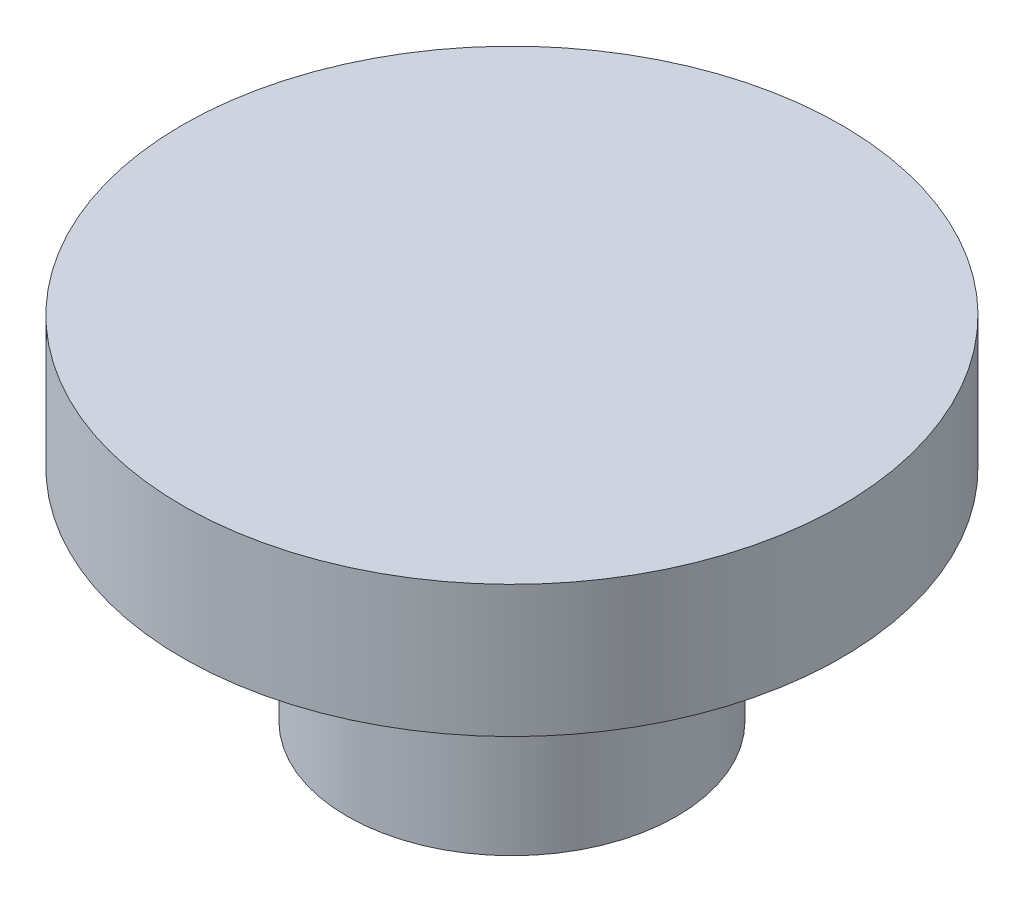
ISO-10303-21;
HEADER;
FILE_DESCRIPTION(('STEP AP214'),'2;1');
FILE_NAME('part.step','',(''),(''),'','','');
FILE_SCHEMA(('AUTOMOTIVE_DESIGN { 1 0 10303 214 1 1 1 1 }'));
ENDSEC;
DATA;
#1=APPLICATION_CONTEXT('core data for automotive mechanical design processes');
#2=APPLICATION_PROTOCOL_DEFINITION('international standard','automotive_design',2000,#1);
#3=PRODUCT_CONTEXT('',#1,'mechanical');
#4=PRODUCT('Part','Part','',(#3));
#5=PRODUCT_RELATED_PRODUCT_CATEGORY('part','',(#4));
#6=PRODUCT_DEFINITION_FORMATION('','',#4);
#7=PRODUCT_DEFINITION_CONTEXT('part definition',#1,'design');
#8=PRODUCT_DEFINITION('design','',#6,#7);
#9=PRODUCT_DEFINITION_SHAPE('','',#8);
#10=(LENGTH_UNIT() NAMED_UNIT(*) SI_UNIT(.MILLI.,.METRE.));
#11=(NAMED_UNIT(*) PLANE_ANGLE_UNIT() SI_UNIT($,.RADIAN.));
#12=(NAMED_UNIT(*) SI_UNIT($,.STERADIAN.) SOLID_ANGLE_UNIT());
#13=UNCERTAINTY_MEASURE_WITH_UNIT(LENGTH_MEASURE(1.E-05),#10,'distance_accuracy_value','');
#14=(GEOMETRIC_REPRESENTATION_CONTEXT(3) GLOBAL_UNCERTAINTY_ASSIGNED_CONTEXT((#13)) GLOBAL_UNIT_ASSIGNED_CONTEXT((#10,
#11,#12)) REPRESENTATION_CONTEXT('',''));
#15=CARTESIAN_POINT('',(0.,0.,0.));
#16=DIRECTION('',(0.,0.,1.));
#17=DIRECTION('',(1.,0.,0.));
#18=AXIS2_PLACEMENT_3D('',#15,#16,#17);
#19=CARTESIAN_POINT('',(0.,0.,0.));
#20=DIRECTION('',(0.,1.,0.));
#21=DIRECTION('',(-1.,0.,0.));
#22=AXIS2_PLACEMENT_3D('',#19,#20,#21);
#23=PLANE('',#22);
#24=CARTESIAN_POINT('',(0.,0.,0.));
#25=DIRECTION('',(0.,1.,0.));
#26=DIRECTION('',(-1.,0.,0.));
#27=AXIS2_PLACEMENT_3D('',#24,#25,#26);
#28=CIRCLE('',#27,7.5);
#29=CARTESIAN_POINT('',(-7.5,0.,0.));
#30=VERTEX_POINT('',#29);
#31=EDGE_CURVE('E10',#30,#30,#28,.T.);
#32=ORIENTED_EDGE('',*,*,#31,.F.);
#33=EDGE_LOOP('',(#32));
#34=FACE_BOUND('',#33,.T.);
#35=ADVANCED_FACE('F35',(#34),#23,.F.);
#36=CARTESIAN_POINT('',(0.,16.,0.));
#37=DIRECTION('',(0.,1.,0.));
#38=DIRECTION('',(-1.,0.,0.));
#39=AXIS2_PLACEMENT_3D('',#36,#37,#38);
#40=CYLINDRICAL_SURFACE('',#39,7.5);
#41=CARTESIAN_POINT('',(0.,8.,0.));
#42=DIRECTION('',(0.,1.,0.));
#43=DIRECTION('',(-1.,0.,0.));
#44=AXIS2_PLACEMENT_3D('',#41,#42,#43);
#45=CIRCLE('',#44,7.5);
#46=CARTESIAN_POINT('',(-7.5,8.,0.));
#47=VERTEX_POINT('',#46);
#48=EDGE_CURVE('E41',#47,#47,#45,.T.);
#49=ORIENTED_EDGE('',*,*,#48,.F.);
#50=EDGE_LOOP('',(#49));
#51=FACE_BOUND('',#50,.T.);
#52=ORIENTED_EDGE('',*,*,#31,.T.);
#53=EDGE_LOOP('',(#52));
#54=FACE_BOUND('',#53,.T.);
#55=ADVANCED_FACE('F83',(#51,#54),#40,.T.);
#56=CARTESIAN_POINT('',(7.5,8.,0.));
#57=DIRECTION('',(0.,-1.,0.));
#58=DIRECTION('',(1.,0.,0.));
#59=AXIS2_PLACEMENT_3D('',#56,#57,#58);
#60=PLANE('',#59);
#61=CARTESIAN_POINT('',(0.,8.,0.));
#62=DIRECTION('',(0.,1.,0.));
#63=DIRECTION('',(-1.,0.,0.));
#64=AXIS2_PLACEMENT_3D('',#61,#62,#63);
#65=CIRCLE('',#64,4.5);
#66=CARTESIAN_POINT('',(-4.5,8.,0.));
#67=VERTEX_POINT('',#66);
#68=EDGE_CURVE('E45',#67,#67,#65,.T.);
#69=ORIENTED_EDGE('',*,*,#68,.F.);
#70=EDGE_LOOP('',(#69));
#71=FACE_BOUND('',#70,.T.);
#72=ORIENTED_EDGE('',*,*,#48,.T.);
#73=EDGE_LOOP('',(#72));
#74=FACE_BOUND('',#73,.T.);
#75=ADVANCED_FACE('F78',(#71,#74),#60,.F.);
#76=CARTESIAN_POINT('',(0.,16.,0.));
#77=DIRECTION('',(0.,1.,0.));
#78=DIRECTION('',(-1.,0.,0.));
#79=AXIS2_PLACEMENT_3D('',#76,#77,#78);
#80=CYLINDRICAL_SURFACE('',#79,4.5);
#81=CARTESIAN_POINT('',(0.,10.,0.));
#82=DIRECTION('',(0.,1.,0.));
#83=DIRECTION('',(-1.,0.,0.));
#84=AXIS2_PLACEMENT_3D('',#81,#82,#83);
#85=CIRCLE('',#84,4.5);
#86=CARTESIAN_POINT('',(-4.5,10.,0.));
#87=VERTEX_POINT('',#86);
#88=EDGE_CURVE('E49',#87,#87,#85,.T.);
#89=ORIENTED_EDGE('',*,*,#88,.F.);
#90=EDGE_LOOP('',(#89));
#91=FACE_BOUND('',#90,.T.);
#92=ORIENTED_EDGE('',*,*,#68,.T.);
#93=EDGE_LOOP('',(#92));
#94=FACE_BOUND('',#93,.T.);
#95=ADVANCED_FACE('F72',(#91,#94),#80,.T.);
#96=CARTESIAN_POINT('',(4.5,10.,0.));
#97=DIRECTION('',(0.,1.,0.));
#98=DIRECTION('',(-1.,0.,0.));
#99=AXIS2_PLACEMENT_3D('',#96,#97,#98);
#100=PLANE('',#99);
#101=CARTESIAN_POINT('',(0.,10.,0.));
#102=DIRECTION('',(0.,1.,0.));
#103=DIRECTION('',(-1.,0.,0.));
#104=AXIS2_PLACEMENT_3D('',#101,#102,#103);
#105=CIRCLE('',#104,15.);
#106=CARTESIAN_POINT('',(-15.,10.,0.));
#107=VERTEX_POINT('',#106);
#108=EDGE_CURVE('E54',#107,#107,#105,.T.);
#109=ORIENTED_EDGE('',*,*,#108,.F.);
#110=EDGE_LOOP('',(#109));
#111=FACE_BOUND('',#110,.T.);
#112=ORIENTED_EDGE('',*,*,#88,.T.);
#113=EDGE_LOOP('',(#112));
#114=FACE_BOUND('',#113,.T.);
#115=ADVANCED_FACE('F66',(#111,#114),#100,.F.);
#116=CARTESIAN_POINT('',(0.,16.,0.));
#117=DIRECTION('',(0.,1.,0.));
#118=DIRECTION('',(-1.,0.,0.));
#119=AXIS2_PLACEMENT_3D('',#116,#117,#118);
#120=CYLINDRICAL_SURFACE('',#119,15.);
#121=CARTESIAN_POINT('',(0.,16.,0.));
#122=DIRECTION('',(0.,1.,0.));
#123=DIRECTION('',(-1.,0.,0.));
#124=AXIS2_PLACEMENT_3D('',#121,#122,#123);
#125=CIRCLE('',#124,15.);
#126=CARTESIAN_POINT('',(-15.,16.,0.));
#127=VERTEX_POINT('',#126);
#128=EDGE_CURVE('E57',#127,#127,#125,.T.);
#129=ORIENTED_EDGE('',*,*,#128,.F.);
#130=EDGE_LOOP('',(#129));
#131=FACE_BOUND('',#130,.T.);
#132=ORIENTED_EDGE('',*,*,#108,.T.);
#133=EDGE_LOOP('',(#132));
#134=FACE_BOUND('',#133,.T.);
#135=ADVANCED_FACE('F63',(#131,#134),#120,.T.);
#136=CARTESIAN_POINT('',(15.,16.,0.));
#137=DIRECTION('',(0.,-1.,0.));
#138=DIRECTION('',(1.,0.,0.));
#139=AXIS2_PLACEMENT_3D('',#136,#137,#138);
#140=PLANE('',#139);
#141=ORIENTED_EDGE('',*,*,#128,.T.);
#142=EDGE_LOOP('',(#141));
#143=FACE_BOUND('',#142,.T.);
#144=ADVANCED_FACE('F61',(#143),#140,.F.);
#145=CLOSED_SHELL('',(#35,#55,#75,#95,#115,#135,#144));
#146=MANIFOLD_SOLID_BREP('B2',#145);
#147=ADVANCED_BREP_SHAPE_REPRESENTATION('',(#18,#146),#14);
#148=SHAPE_DEFINITION_REPRESENTATION(#9,#147);
ENDSEC;
END-ISO-10303-21;
